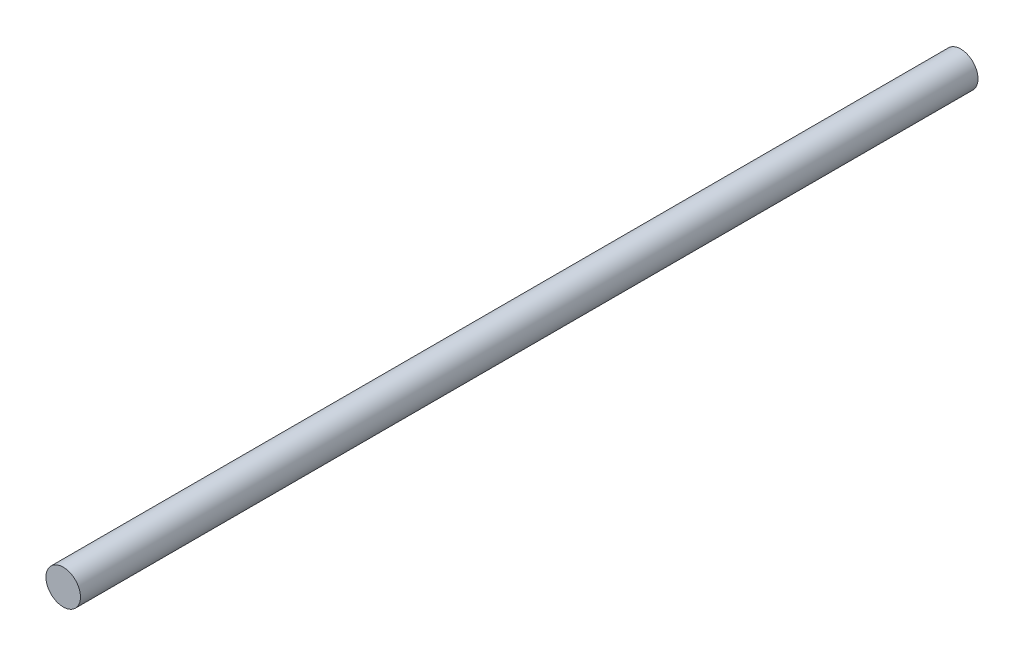
ISO-10303-21;
HEADER;
FILE_DESCRIPTION(('STEP AP214'),'2;1');
FILE_NAME('part.step','',(''),(''),'','','');
FILE_SCHEMA(('AUTOMOTIVE_DESIGN { 1 0 10303 214 1 1 1 1 }'));
ENDSEC;
DATA;
#1=APPLICATION_CONTEXT('core data for automotive mechanical design processes');
#2=APPLICATION_PROTOCOL_DEFINITION('international standard','automotive_design',2000,#1);
#3=PRODUCT_CONTEXT('',#1,'mechanical');
#4=PRODUCT('Part','Part','',(#3));
#5=PRODUCT_RELATED_PRODUCT_CATEGORY('part','',(#4));
#6=PRODUCT_DEFINITION_FORMATION('','',#4);
#7=PRODUCT_DEFINITION_CONTEXT('part definition',#1,'design');
#8=PRODUCT_DEFINITION('design','',#6,#7);
#9=PRODUCT_DEFINITION_SHAPE('','',#8);
#10=(LENGTH_UNIT() NAMED_UNIT(*) SI_UNIT(.MILLI.,.METRE.));
#11=(NAMED_UNIT(*) PLANE_ANGLE_UNIT() SI_UNIT($,.RADIAN.));
#12=(NAMED_UNIT(*) SI_UNIT($,.STERADIAN.) SOLID_ANGLE_UNIT());
#13=UNCERTAINTY_MEASURE_WITH_UNIT(LENGTH_MEASURE(1.E-05),#10,'distance_accuracy_value','');
#14=(GEOMETRIC_REPRESENTATION_CONTEXT(3) GLOBAL_UNCERTAINTY_ASSIGNED_CONTEXT((#13)) GLOBAL_UNIT_ASSIGNED_CONTEXT((#10,
#11,#12)) REPRESENTATION_CONTEXT('',''));
#15=CARTESIAN_POINT('',(0.,0.,0.));
#16=DIRECTION('',(0.,0.,1.));
#17=DIRECTION('',(1.,0.,0.));
#18=AXIS2_PLACEMENT_3D('',#15,#16,#17);
#19=CARTESIAN_POINT('',(0.,0.,250.));
#20=DIRECTION('',(0.,0.,-1.));
#21=DIRECTION('',(-1.,0.,0.));
#22=AXIS2_PLACEMENT_3D('',#19,#20,#21);
#23=CYLINDRICAL_SURFACE('',#22,5.);
#24=CARTESIAN_POINT('',(0.,0.,0.));
#25=DIRECTION('',(0.,0.,1.));
#26=DIRECTION('',(1.,0.,0.));
#27=AXIS2_PLACEMENT_3D('',#24,#25,#26);
#28=CIRCLE('',#27,5.);
#29=CARTESIAN_POINT('',(5.,0.,0.));
#30=VERTEX_POINT('',#29);
#31=EDGE_CURVE('E10',#30,#30,#28,.T.);
#32=ORIENTED_EDGE('',*,*,#31,.T.);
#33=EDGE_LOOP('',(#32));
#34=FACE_BOUND('',#33,.T.);
#35=CARTESIAN_POINT('',(0.,0.,260.));
#36=DIRECTION('',(0.,0.,1.));
#37=DIRECTION('',(1.,0.,0.));
#38=AXIS2_PLACEMENT_3D('',#35,#36,#37);
#39=CIRCLE('',#38,5.);
#40=CARTESIAN_POINT('',(5.,0.,260.));
#41=VERTEX_POINT('',#40);
#42=EDGE_CURVE('E41',#41,#41,#39,.T.);
#43=ORIENTED_EDGE('',*,*,#42,.F.);
#44=EDGE_LOOP('',(#43));
#45=FACE_BOUND('',#44,.T.);
#46=ADVANCED_FACE('F35',(#34,#45),#23,.T.);
#47=CARTESIAN_POINT('',(0.,0.,0.));
#48=DIRECTION('',(0.,0.,1.));
#49=DIRECTION('',(1.,0.,0.));
#50=AXIS2_PLACEMENT_3D('',#47,#48,#49);
#51=PLANE('',#50);
#52=ORIENTED_EDGE('',*,*,#31,.F.);
#53=EDGE_LOOP('',(#52));
#54=FACE_BOUND('',#53,.T.);
#55=ADVANCED_FACE('F50',(#54),#51,.F.);
#56=CARTESIAN_POINT('',(0.,0.,260.));
#57=DIRECTION('',(0.,0.,1.));
#58=DIRECTION('',(1.,0.,0.));
#59=AXIS2_PLACEMENT_3D('',#56,#57,#58);
#60=PLANE('',#59);
#61=ORIENTED_EDGE('',*,*,#42,.T.);
#62=EDGE_LOOP('',(#61));
#63=FACE_BOUND('',#62,.T.);
#64=ADVANCED_FACE('F47',(#63),#60,.T.);
#65=CLOSED_SHELL('',(#46,#55,#64));
#66=MANIFOLD_SOLID_BREP('B2',#65);
#67=ADVANCED_BREP_SHAPE_REPRESENTATION('',(#18,#66),#14);
#68=SHAPE_DEFINITION_REPRESENTATION(#9,#67);
ENDSEC;
END-ISO-10303-21;
